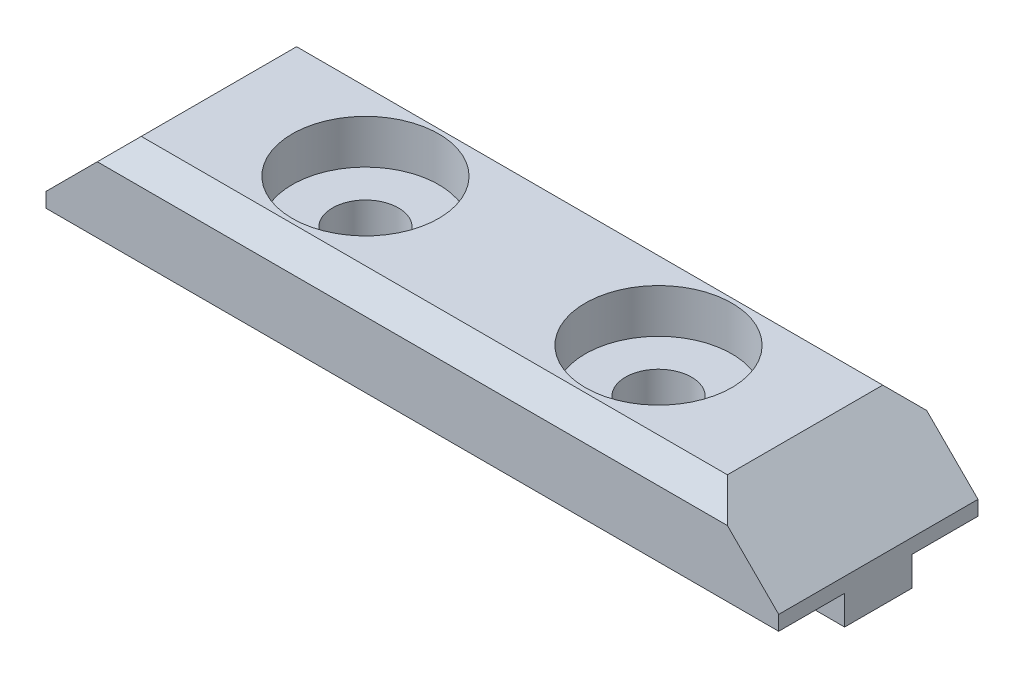
ISO-10303-21;
HEADER;
FILE_DESCRIPTION(('STEP AP214'),'2;1');
FILE_NAME('part.step','',(''),(''),'','','');
FILE_SCHEMA(('AUTOMOTIVE_DESIGN { 1 0 10303 214 1 1 1 1 }'));
ENDSEC;
DATA;
#1=APPLICATION_CONTEXT('core data for automotive mechanical design processes');
#2=APPLICATION_PROTOCOL_DEFINITION('international standard','automotive_design',2000,#1);
#3=PRODUCT_CONTEXT('',#1,'mechanical');
#4=PRODUCT('Part','Part','',(#3));
#5=PRODUCT_RELATED_PRODUCT_CATEGORY('part','',(#4));
#6=PRODUCT_DEFINITION_FORMATION('','',#4);
#7=PRODUCT_DEFINITION_CONTEXT('part definition',#1,'design');
#8=PRODUCT_DEFINITION('design','',#6,#7);
#9=PRODUCT_DEFINITION_SHAPE('','',#8);
#10=(LENGTH_UNIT() NAMED_UNIT(*) SI_UNIT(.MILLI.,.METRE.));
#11=(NAMED_UNIT(*) PLANE_ANGLE_UNIT() SI_UNIT($,.RADIAN.));
#12=(NAMED_UNIT(*) SI_UNIT($,.STERADIAN.) SOLID_ANGLE_UNIT());
#13=UNCERTAINTY_MEASURE_WITH_UNIT(LENGTH_MEASURE(1.E-05),#10,'distance_accuracy_value','');
#14=(GEOMETRIC_REPRESENTATION_CONTEXT(3) GLOBAL_UNCERTAINTY_ASSIGNED_CONTEXT((#13)) GLOBAL_UNIT_ASSIGNED_CONTEXT((#10,
#11,#12)) REPRESENTATION_CONTEXT('',''));
#15=CARTESIAN_POINT('',(0.,0.,0.));
#16=DIRECTION('',(0.,0.,1.));
#17=DIRECTION('',(1.,0.,0.));
#18=AXIS2_PLACEMENT_3D('',#15,#16,#17);
#19=CARTESIAN_POINT('',(50.,2.,2.3));
#20=DIRECTION('',(0.,0.,-1.));
#21=DIRECTION('',(0.,1.,0.));
#22=AXIS2_PLACEMENT_3D('',#19,#20,#21);
#23=PLANE('',#22);
#24=DIRECTION('',(0.,-1.,0.));
#25=VECTOR('',#24,1.);
#26=CARTESIAN_POINT('',(0.,2.,2.3));
#27=LINE('',#26,#25);
#28=CARTESIAN_POINT('',(0.,2.,2.3));
#29=VERTEX_POINT('',#28);
#30=CARTESIAN_POINT('',(0.,0.,2.3));
#31=VERTEX_POINT('',#30);
#32=EDGE_CURVE('E156',#29,#31,#27,.T.);
#33=ORIENTED_EDGE('',*,*,#32,.T.);
#34=DIRECTION('',(-1.,0.,0.));
#35=VECTOR('',#34,1.);
#36=CARTESIAN_POINT('',(50.,0.,2.3));
#37=LINE('',#36,#35);
#38=CARTESIAN_POINT('',(50.,0.,2.3));
#39=VERTEX_POINT('',#38);
#40=EDGE_CURVE('E136',#39,#31,#37,.T.);
#41=ORIENTED_EDGE('',*,*,#40,.F.);
#42=DIRECTION('',(0.,-1.,0.));
#43=VECTOR('',#42,1.);
#44=CARTESIAN_POINT('',(50.,2.,2.3));
#45=LINE('',#44,#43);
#46=CARTESIAN_POINT('',(50.,2.,2.3));
#47=VERTEX_POINT('',#46);
#48=EDGE_CURVE('E143',#47,#39,#45,.T.);
#49=ORIENTED_EDGE('',*,*,#48,.F.);
#50=DIRECTION('',(-1.,0.,0.));
#51=VECTOR('',#50,1.);
#52=CARTESIAN_POINT('',(50.,2.,2.3));
#53=LINE('',#52,#51);
#54=EDGE_CURVE('E218',#47,#29,#53,.T.);
#55=ORIENTED_EDGE('',*,*,#54,.T.);
#56=EDGE_LOOP('',(#33,#41,#49,#55));
#57=FACE_BOUND('',#56,.T.);
#58=ADVANCED_FACE('F38',(#57),#23,.F.);
#59=CARTESIAN_POINT('',(50.,0.,2.3));
#60=DIRECTION('',(0.,1.,0.));
#61=DIRECTION('',(0.,0.,1.));
#62=AXIS2_PLACEMENT_3D('',#59,#60,#61);
#63=PLANE('',#62);
#64=CARTESIAN_POINT('',(15.,0.,0.));
#65=DIRECTION('',(0.,1.,0.));
#66=DIRECTION('',(0.,0.,1.));
#67=AXIS2_PLACEMENT_3D('',#64,#65,#66);
#68=CIRCLE('',#67,2.24999999999999);
#69=CARTESIAN_POINT('',(15.,0.,2.24999999999999));
#70=VERTEX_POINT('',#69);
#71=EDGE_CURVE('E43',#70,#70,#68,.T.);
#72=ORIENTED_EDGE('',*,*,#71,.T.);
#73=EDGE_LOOP('',(#72));
#74=FACE_BOUND('',#73,.T.);
#75=CARTESIAN_POINT('',(35.,0.,0.));
#76=DIRECTION('',(0.,1.,0.));
#77=DIRECTION('',(0.,0.,1.));
#78=AXIS2_PLACEMENT_3D('',#75,#76,#77);
#79=CIRCLE('',#78,2.24999999999998);
#80=CARTESIAN_POINT('',(35.,0.,2.24999999999998));
#81=VERTEX_POINT('',#80);
#82=EDGE_CURVE('E194',#81,#81,#79,.T.);
#83=ORIENTED_EDGE('',*,*,#82,.T.);
#84=EDGE_LOOP('',(#83));
#85=FACE_BOUND('',#84,.T.);
#86=DIRECTION('',(0.,0.,-1.));
#87=VECTOR('',#86,1.);
#88=CARTESIAN_POINT('',(0.,0.,2.3));
#89=LINE('',#88,#87);
#90=CARTESIAN_POINT('',(0.,0.,-2.3));
#91=VERTEX_POINT('',#90);
#92=EDGE_CURVE('E199',#31,#91,#89,.T.);
#93=ORIENTED_EDGE('',*,*,#92,.T.);
#94=DIRECTION('',(-1.,0.,0.));
#95=VECTOR('',#94,1.);
#96=CARTESIAN_POINT('',(50.,0.,-2.3));
#97=LINE('',#96,#95);
#98=CARTESIAN_POINT('',(50.,0.,-2.3));
#99=VERTEX_POINT('',#98);
#100=EDGE_CURVE('E139',#99,#91,#97,.T.);
#101=ORIENTED_EDGE('',*,*,#100,.F.);
#102=DIRECTION('',(0.,0.,-1.));
#103=VECTOR('',#102,1.);
#104=CARTESIAN_POINT('',(50.,0.,2.3));
#105=LINE('',#104,#103);
#106=EDGE_CURVE('E132',#39,#99,#105,.T.);
#107=ORIENTED_EDGE('',*,*,#106,.F.);
#108=ORIENTED_EDGE('',*,*,#40,.T.);
#109=EDGE_LOOP('',(#93,#101,#107,#108));
#110=FACE_BOUND('',#109,.T.);
#111=ADVANCED_FACE('F134',(#74,#85,#110),#63,.F.);
#112=CARTESIAN_POINT('',(50.,0.,-2.3));
#113=DIRECTION('',(0.,0.,1.));
#114=DIRECTION('',(0.,-1.,0.));
#115=AXIS2_PLACEMENT_3D('',#112,#113,#114);
#116=PLANE('',#115);
#117=DIRECTION('',(0.,1.,0.));
#118=VECTOR('',#117,1.);
#119=CARTESIAN_POINT('',(0.,0.,-2.3));
#120=LINE('',#119,#118);
#121=CARTESIAN_POINT('',(0.,2.,-2.3));
#122=VERTEX_POINT('',#121);
#123=EDGE_CURVE('E221',#91,#122,#120,.T.);
#124=ORIENTED_EDGE('',*,*,#123,.T.);
#125=DIRECTION('',(-1.,0.,0.));
#126=VECTOR('',#125,1.);
#127=CARTESIAN_POINT('',(50.,2.,-2.3));
#128=LINE('',#127,#126);
#129=CARTESIAN_POINT('',(50.,2.,-2.3));
#130=VERTEX_POINT('',#129);
#131=EDGE_CURVE('E162',#130,#122,#128,.T.);
#132=ORIENTED_EDGE('',*,*,#131,.F.);
#133=DIRECTION('',(0.,1.,0.));
#134=VECTOR('',#133,1.);
#135=CARTESIAN_POINT('',(50.,0.,-2.3));
#136=LINE('',#135,#134);
#137=EDGE_CURVE('E142',#99,#130,#136,.T.);
#138=ORIENTED_EDGE('',*,*,#137,.F.);
#139=ORIENTED_EDGE('',*,*,#100,.T.);
#140=EDGE_LOOP('',(#124,#132,#138,#139));
#141=FACE_BOUND('',#140,.T.);
#142=ADVANCED_FACE('F265',(#141),#116,.F.);
#143=CARTESIAN_POINT('',(50.,2.,-2.3));
#144=DIRECTION('',(0.,1.,0.));
#145=DIRECTION('',(0.,0.,1.));
#146=AXIS2_PLACEMENT_3D('',#143,#144,#145);
#147=PLANE('',#146);
#148=DIRECTION('',(0.,0.,-1.));
#149=VECTOR('',#148,1.);
#150=CARTESIAN_POINT('',(0.,2.,-2.3));
#151=LINE('',#150,#149);
#152=CARTESIAN_POINT('',(0.,2.,-6.8));
#153=VERTEX_POINT('',#152);
#154=EDGE_CURVE('E223',#122,#153,#151,.T.);
#155=ORIENTED_EDGE('',*,*,#154,.T.);
#156=DIRECTION('',(-1.,0.,0.));
#157=VECTOR('',#156,1.);
#158=CARTESIAN_POINT('',(50.,2.,-6.8));
#159=LINE('',#158,#157);
#160=CARTESIAN_POINT('',(50.,2.,-6.8));
#161=VERTEX_POINT('',#160);
#162=EDGE_CURVE('E234',#161,#153,#159,.T.);
#163=ORIENTED_EDGE('',*,*,#162,.F.);
#164=DIRECTION('',(0.,0.,-1.));
#165=VECTOR('',#164,1.);
#166=CARTESIAN_POINT('',(50.,2.,-2.3));
#167=LINE('',#166,#165);
#168=EDGE_CURVE('E212',#130,#161,#167,.T.);
#169=ORIENTED_EDGE('',*,*,#168,.F.);
#170=ORIENTED_EDGE('',*,*,#131,.T.);
#171=EDGE_LOOP('',(#155,#163,#169,#170));
#172=FACE_BOUND('',#171,.T.);
#173=ADVANCED_FACE('F241',(#172),#147,.F.);
#174=CARTESIAN_POINT('',(50.,2.,-6.8));
#175=DIRECTION('',(0.,0.,1.));
#176=DIRECTION('',(0.,-1.,0.));
#177=AXIS2_PLACEMENT_3D('',#174,#175,#176);
#178=PLANE('',#177);
#179=DIRECTION('',(1.,0.,0.));
#180=VECTOR('',#179,1.);
#181=CARTESIAN_POINT('',(50.,6.49999999999999,-6.8));
#182=LINE('',#181,#180);
#183=CARTESIAN_POINT('',(3.5,6.49999999999999,-6.8));
#184=VERTEX_POINT('',#183);
#185=CARTESIAN_POINT('',(46.5,6.49999999999999,-6.8));
#186=VERTEX_POINT('',#185);
#187=EDGE_CURVE('E168',#184,#186,#182,.T.);
#188=ORIENTED_EDGE('',*,*,#187,.T.);
#189=DIRECTION('',(0.707106781186549,-0.707106781186546,0.));
#190=VECTOR('',#189,1.);
#191=CARTESIAN_POINT('',(50.,3.00000000000001,-6.8));
#192=LINE('',#191,#190);
#193=CARTESIAN_POINT('',(50.,3.00000000000001,-6.8));
#194=VERTEX_POINT('',#193);
#195=EDGE_CURVE('E48',#186,#194,#192,.T.);
#196=ORIENTED_EDGE('',*,*,#195,.T.);
#197=DIRECTION('',(0.,1.,0.));
#198=VECTOR('',#197,1.);
#199=CARTESIAN_POINT('',(50.,2.,-6.8));
#200=LINE('',#199,#198);
#201=EDGE_CURVE('E214',#161,#194,#200,.T.);
#202=ORIENTED_EDGE('',*,*,#201,.F.);
#203=ORIENTED_EDGE('',*,*,#162,.T.);
#204=DIRECTION('',(0.,1.,0.));
#205=VECTOR('',#204,1.);
#206=CARTESIAN_POINT('',(0.,2.,-6.8));
#207=LINE('',#206,#205);
#208=CARTESIAN_POINT('',(0.,2.99999999999999,-6.8));
#209=VERTEX_POINT('',#208);
#210=EDGE_CURVE('E225',#153,#209,#207,.T.);
#211=ORIENTED_EDGE('',*,*,#210,.T.);
#212=DIRECTION('',(-0.707106781186547,-0.707106781186549,0.));
#213=VECTOR('',#212,1.);
#214=CARTESIAN_POINT('',(5.,8.,-6.8));
#215=LINE('',#214,#213);
#216=EDGE_CURVE('E192',#209,#184,#215,.F.);
#217=ORIENTED_EDGE('',*,*,#216,.T.);
#218=EDGE_LOOP('',(#188,#196,#202,#203,#211,#217));
#219=FACE_BOUND('',#218,.T.);
#220=ADVANCED_FACE('F248',(#219),#178,.F.);
#221=CARTESIAN_POINT('',(50.,8.,-6.8));
#222=DIRECTION('',(0.,-1.,0.));
#223=DIRECTION('',(0.,0.,-1.));
#224=AXIS2_PLACEMENT_3D('',#221,#222,#223);
#225=PLANE('',#224);
#226=CARTESIAN_POINT('',(15.,8.,0.));
#227=DIRECTION('',(0.,1.,0.));
#228=DIRECTION('',(0.,0.,1.));
#229=AXIS2_PLACEMENT_3D('',#226,#227,#228);
#230=CIRCLE('',#229,5.);
#231=CARTESIAN_POINT('',(15.,8.,5.));
#232=VERTEX_POINT('',#231);
#233=EDGE_CURVE('E497',#232,#232,#230,.T.);
#234=ORIENTED_EDGE('',*,*,#233,.F.);
#235=EDGE_LOOP('',(#234));
#236=FACE_BOUND('',#235,.T.);
#237=CARTESIAN_POINT('',(35.,8.,0.));
#238=DIRECTION('',(0.,1.,0.));
#239=DIRECTION('',(0.,0.,1.));
#240=AXIS2_PLACEMENT_3D('',#237,#238,#239);
#241=CIRCLE('',#240,5.);
#242=CARTESIAN_POINT('',(35.,8.,5.));
#243=VERTEX_POINT('',#242);
#244=EDGE_CURVE('E207',#243,#243,#241,.T.);
#245=ORIENTED_EDGE('',*,*,#244,.F.);
#246=EDGE_LOOP('',(#245));
#247=FACE_BOUND('',#246,.T.);
#248=DIRECTION('',(1.,0.,0.));
#249=VECTOR('',#248,1.);
#250=CARTESIAN_POINT('',(50.,8.,5.30000000000001));
#251=LINE('',#250,#249);
#252=CARTESIAN_POINT('',(5.,8.,5.30000000000001));
#253=VERTEX_POINT('',#252);
#254=CARTESIAN_POINT('',(45.,8.,5.30000000000001));
#255=VERTEX_POINT('',#254);
#256=EDGE_CURVE('E157',#253,#255,#251,.T.);
#257=ORIENTED_EDGE('',*,*,#256,.T.);
#258=DIRECTION('',(0.,0.,-1.));
#259=VECTOR('',#258,1.);
#260=CARTESIAN_POINT('',(45.,8.,-5.29999999999999));
#261=LINE('',#260,#259);
#262=CARTESIAN_POINT('',(45.,8.,-5.29999999999999));
#263=VERTEX_POINT('',#262);
#264=EDGE_CURVE('E187',#255,#263,#261,.T.);
#265=ORIENTED_EDGE('',*,*,#264,.T.);
#266=DIRECTION('',(-1.,0.,0.));
#267=VECTOR('',#266,1.);
#268=CARTESIAN_POINT('',(50.,8.,-5.29999999999999));
#269=LINE('',#268,#267);
#270=CARTESIAN_POINT('',(5.,8.,-5.29999999999999));
#271=VERTEX_POINT('',#270);
#272=EDGE_CURVE('E160',#263,#271,#269,.T.);
#273=ORIENTED_EDGE('',*,*,#272,.T.);
#274=DIRECTION('',(0.,0.,1.));
#275=VECTOR('',#274,1.);
#276=CARTESIAN_POINT('',(5.,8.,-6.8));
#277=LINE('',#276,#275);
#278=EDGE_CURVE('E184',#271,#253,#277,.T.);
#279=ORIENTED_EDGE('',*,*,#278,.T.);
#280=EDGE_LOOP('',(#257,#265,#273,#279));
#281=FACE_BOUND('',#280,.T.);
#282=ADVANCED_FACE('F256',(#236,#247,#281),#225,.F.);
#283=CARTESIAN_POINT('',(50.,8.,6.8));
#284=DIRECTION('',(0.,0.,-1.));
#285=DIRECTION('',(0.,1.,0.));
#286=AXIS2_PLACEMENT_3D('',#283,#284,#285);
#287=PLANE('',#286);
#288=DIRECTION('',(0.,-1.,0.));
#289=VECTOR('',#288,1.);
#290=CARTESIAN_POINT('',(50.,8.,6.8));
#291=LINE('',#290,#289);
#292=CARTESIAN_POINT('',(50.,3.00000000000001,6.8));
#293=VERTEX_POINT('',#292);
#294=CARTESIAN_POINT('',(50.,2.,6.8));
#295=VERTEX_POINT('',#294);
#296=EDGE_CURVE('E216',#293,#295,#291,.T.);
#297=ORIENTED_EDGE('',*,*,#296,.F.);
#298=DIRECTION('',(-0.707106781186549,0.707106781186546,0.));
#299=VECTOR('',#298,1.);
#300=CARTESIAN_POINT('',(50.,3.00000000000001,6.8));
#301=LINE('',#300,#299);
#302=CARTESIAN_POINT('',(46.5,6.50000000000002,6.8));
#303=VERTEX_POINT('',#302);
#304=EDGE_CURVE('E178',#293,#303,#301,.T.);
#305=ORIENTED_EDGE('',*,*,#304,.T.);
#306=DIRECTION('',(-1.,0.,0.));
#307=VECTOR('',#306,1.);
#308=CARTESIAN_POINT('',(50.,6.50000000000002,6.8));
#309=LINE('',#308,#307);
#310=CARTESIAN_POINT('',(3.50000000000001,6.50000000000002,6.8));
#311=VERTEX_POINT('',#310);
#312=EDGE_CURVE('E170',#303,#311,#309,.T.);
#313=ORIENTED_EDGE('',*,*,#312,.T.);
#314=DIRECTION('',(0.707106781186547,0.707106781186549,0.));
#315=VECTOR('',#314,1.);
#316=CARTESIAN_POINT('',(5.,8.,6.8));
#317=LINE('',#316,#315);
#318=CARTESIAN_POINT('',(0.,2.99999999999999,6.8));
#319=VERTEX_POINT('',#318);
#320=EDGE_CURVE('E176',#311,#319,#317,.F.);
#321=ORIENTED_EDGE('',*,*,#320,.T.);
#322=DIRECTION('',(0.,-1.,0.));
#323=VECTOR('',#322,1.);
#324=CARTESIAN_POINT('',(0.,8.,6.8));
#325=LINE('',#324,#323);
#326=CARTESIAN_POINT('',(0.,2.,6.8));
#327=VERTEX_POINT('',#326);
#328=EDGE_CURVE('E227',#319,#327,#325,.T.);
#329=ORIENTED_EDGE('',*,*,#328,.T.);
#330=DIRECTION('',(-1.,0.,0.));
#331=VECTOR('',#330,1.);
#332=CARTESIAN_POINT('',(50.,2.,6.8));
#333=LINE('',#332,#331);
#334=EDGE_CURVE('E231',#295,#327,#333,.T.);
#335=ORIENTED_EDGE('',*,*,#334,.F.);
#336=EDGE_LOOP('',(#297,#305,#313,#321,#329,#335));
#337=FACE_BOUND('',#336,.T.);
#338=ADVANCED_FACE('F320',(#337),#287,.F.);
#339=CARTESIAN_POINT('',(50.,2.,6.8));
#340=DIRECTION('',(0.,1.,0.));
#341=DIRECTION('',(0.,0.,1.));
#342=AXIS2_PLACEMENT_3D('',#339,#340,#341);
#343=PLANE('',#342);
#344=DIRECTION('',(0.,0.,-1.));
#345=VECTOR('',#344,1.);
#346=CARTESIAN_POINT('',(0.,2.,6.8));
#347=LINE('',#346,#345);
#348=EDGE_CURVE('E153',#327,#29,#347,.T.);
#349=ORIENTED_EDGE('',*,*,#348,.T.);
#350=ORIENTED_EDGE('',*,*,#54,.F.);
#351=DIRECTION('',(0.,0.,-1.));
#352=VECTOR('',#351,1.);
#353=CARTESIAN_POINT('',(50.,2.,6.8));
#354=LINE('',#353,#352);
#355=EDGE_CURVE('E149',#295,#47,#354,.T.);
#356=ORIENTED_EDGE('',*,*,#355,.F.);
#357=ORIENTED_EDGE('',*,*,#334,.T.);
#358=EDGE_LOOP('',(#349,#350,#356,#357));
#359=FACE_BOUND('',#358,.T.);
#360=ADVANCED_FACE('F315',(#359),#343,.F.);
#361=CARTESIAN_POINT('',(50.,0.,0.));
#362=DIRECTION('',(1.,0.,0.));
#363=DIRECTION('',(0.,0.,-1.));
#364=AXIS2_PLACEMENT_3D('',#361,#362,#363);
#365=PLANE('',#364);
#366=ORIENTED_EDGE('',*,*,#201,.T.);
#367=DIRECTION('',(0.,0.,1.));
#368=VECTOR('',#367,1.);
#369=CARTESIAN_POINT('',(50.,3.00000000000001,5.30000000000001));
#370=LINE('',#369,#368);
#371=EDGE_CURVE('E173',#194,#293,#370,.T.);
#372=ORIENTED_EDGE('',*,*,#371,.T.);
#373=ORIENTED_EDGE('',*,*,#296,.T.);
#374=ORIENTED_EDGE('',*,*,#355,.T.);
#375=ORIENTED_EDGE('',*,*,#48,.T.);
#376=ORIENTED_EDGE('',*,*,#106,.T.);
#377=ORIENTED_EDGE('',*,*,#137,.T.);
#378=ORIENTED_EDGE('',*,*,#168,.T.);
#379=EDGE_LOOP('',(#366,#372,#373,#374,#375,#376,#377,#378));
#380=FACE_BOUND('',#379,.T.);
#381=ADVANCED_FACE('F147',(#380),#365,.T.);
#382=CARTESIAN_POINT('',(0.,0.,0.));
#383=DIRECTION('',(1.,0.,0.));
#384=DIRECTION('',(0.,0.,-1.));
#385=AXIS2_PLACEMENT_3D('',#382,#383,#384);
#386=PLANE('',#385);
#387=ORIENTED_EDGE('',*,*,#328,.F.);
#388=DIRECTION('',(0.,0.,-1.));
#389=VECTOR('',#388,1.);
#390=CARTESIAN_POINT('',(0.,2.99999999999999,0.));
#391=LINE('',#390,#389);
#392=EDGE_CURVE('E11',#319,#209,#391,.T.);
#393=ORIENTED_EDGE('',*,*,#392,.T.);
#394=ORIENTED_EDGE('',*,*,#210,.F.);
#395=ORIENTED_EDGE('',*,*,#154,.F.);
#396=ORIENTED_EDGE('',*,*,#123,.F.);
#397=ORIENTED_EDGE('',*,*,#92,.F.);
#398=ORIENTED_EDGE('',*,*,#32,.F.);
#399=ORIENTED_EDGE('',*,*,#348,.F.);
#400=EDGE_LOOP('',(#387,#393,#394,#395,#396,#397,#398,#399));
#401=FACE_BOUND('',#400,.T.);
#402=ADVANCED_FACE('F245',(#401),#386,.F.);
#403=CARTESIAN_POINT('',(50.,8.,-5.29999999999999));
#404=DIRECTION('',(0.,-0.707106781186548,0.707106781186548));
#405=DIRECTION('',(-1.,0.,0.));
#406=AXIS2_PLACEMENT_3D('',#403,#404,#405);
#407=PLANE('',#406);
#408=ORIENTED_EDGE('',*,*,#272,.F.);
#409=DIRECTION('',(-0.577350269189628,0.577350269189625,0.577350269189625));
#410=VECTOR('',#409,1.);
#411=CARTESIAN_POINT('',(46.6666666666667,6.33333333333333,-6.96666666666666));
#412=LINE('',#411,#410);
#413=EDGE_CURVE('E62',#263,#186,#412,.F.);
#414=ORIENTED_EDGE('',*,*,#413,.T.);
#415=ORIENTED_EDGE('',*,*,#187,.F.);
#416=DIRECTION('',(0.577350269189625,0.577350269189626,0.577350269189626));
#417=VECTOR('',#416,1.);
#418=CARTESIAN_POINT('',(19.9999999999999,23.,9.7));
#419=LINE('',#418,#417);
#420=EDGE_CURVE('E189',#184,#271,#419,.T.);
#421=ORIENTED_EDGE('',*,*,#420,.T.);
#422=EDGE_LOOP('',(#408,#414,#415,#421));
#423=FACE_BOUND('',#422,.T.);
#424=ADVANCED_FACE('F254',(#423),#407,.F.);
#425=CARTESIAN_POINT('',(50.,6.50000000000002,6.8));
#426=DIRECTION('',(0.,-0.707106781186549,-0.707106781186546));
#427=DIRECTION('',(-1.,0.,0.));
#428=AXIS2_PLACEMENT_3D('',#425,#426,#427);
#429=PLANE('',#428);
#430=ORIENTED_EDGE('',*,*,#312,.F.);
#431=DIRECTION('',(0.577350269189627,-0.577350269189624,0.577350269189627));
#432=VECTOR('',#431,1.);
#433=CARTESIAN_POINT('',(47.6666666666667,5.33333333333335,7.96666666666668));
#434=LINE('',#433,#432);
#435=EDGE_CURVE('E182',#303,#255,#434,.F.);
#436=ORIENTED_EDGE('',*,*,#435,.T.);
#437=ORIENTED_EDGE('',*,*,#256,.F.);
#438=DIRECTION('',(-0.577350269189624,-0.577350269189626,0.577350269189628));
#439=VECTOR('',#438,1.);
#440=CARTESIAN_POINT('',(18.9999999999999,22.,-8.7));
#441=LINE('',#440,#439);
#442=EDGE_CURVE('E180',#253,#311,#441,.T.);
#443=ORIENTED_EDGE('',*,*,#442,.T.);
#444=EDGE_LOOP('',(#430,#436,#437,#443));
#445=FACE_BOUND('',#444,.T.);
#446=ADVANCED_FACE('F286',(#445),#429,.F.);
#447=CARTESIAN_POINT('',(50.,3.00000000000001,0.));
#448=DIRECTION('',(0.707106781186546,0.707106781186549,0.));
#449=DIRECTION('',(0.,0.,-1.));
#450=AXIS2_PLACEMENT_3D('',#447,#448,#449);
#451=PLANE('',#450);
#452=ORIENTED_EDGE('',*,*,#413,.F.);
#453=ORIENTED_EDGE('',*,*,#264,.F.);
#454=ORIENTED_EDGE('',*,*,#435,.F.);
#455=ORIENTED_EDGE('',*,*,#304,.F.);
#456=ORIENTED_EDGE('',*,*,#371,.F.);
#457=ORIENTED_EDGE('',*,*,#195,.F.);
#458=EDGE_LOOP('',(#452,#453,#454,#455,#456,#457));
#459=FACE_BOUND('',#458,.T.);
#460=ADVANCED_FACE('F261',(#459),#451,.T.);
#461=CARTESIAN_POINT('',(5.,8.,-6.8));
#462=DIRECTION('',(0.707106781186548,-0.707106781186546,0.));
#463=DIRECTION('',(0.,0.,1.));
#464=AXIS2_PLACEMENT_3D('',#461,#462,#463);
#465=PLANE('',#464);
#466=ORIENTED_EDGE('',*,*,#216,.F.);
#467=ORIENTED_EDGE('',*,*,#392,.F.);
#468=ORIENTED_EDGE('',*,*,#320,.F.);
#469=ORIENTED_EDGE('',*,*,#442,.F.);
#470=ORIENTED_EDGE('',*,*,#278,.F.);
#471=ORIENTED_EDGE('',*,*,#420,.F.);
#472=EDGE_LOOP('',(#466,#467,#468,#469,#470,#471));
#473=FACE_BOUND('',#472,.T.);
#474=ADVANCED_FACE('F41',(#473),#465,.F.);
#475=CARTESIAN_POINT('',(35.,8.,0.));
#476=DIRECTION('',(0.,1.,0.));
#477=DIRECTION('',(0.,0.,1.));
#478=AXIS2_PLACEMENT_3D('',#475,#476,#477);
#479=CYLINDRICAL_SURFACE('',#478,2.24999999999998);
#480=CARTESIAN_POINT('',(35.,5.,0.));
#481=DIRECTION('',(0.,1.,0.));
#482=DIRECTION('',(0.,0.,1.));
#483=AXIS2_PLACEMENT_3D('',#480,#481,#482);
#484=CIRCLE('',#483,2.24999999999999);
#485=CARTESIAN_POINT('',(35.,5.,2.24999999999999));
#486=VERTEX_POINT('',#485);
#487=EDGE_CURVE('E196',#486,#486,#484,.T.);
#488=ORIENTED_EDGE('',*,*,#487,.T.);
#489=EDGE_LOOP('',(#488));
#490=FACE_BOUND('',#489,.T.);
#491=ORIENTED_EDGE('',*,*,#82,.F.);
#492=EDGE_LOOP('',(#491));
#493=FACE_BOUND('',#492,.T.);
#494=ADVANCED_FACE('F298',(#490,#493),#479,.F.);
#495=CARTESIAN_POINT('',(37.25,5.,0.));
#496=DIRECTION('',(0.,-1.,0.));
#497=DIRECTION('',(0.,0.,-1.));
#498=AXIS2_PLACEMENT_3D('',#495,#496,#497);
#499=PLANE('',#498);
#500=ORIENTED_EDGE('',*,*,#487,.F.);
#501=EDGE_LOOP('',(#500));
#502=FACE_BOUND('',#501,.T.);
#503=CARTESIAN_POINT('',(35.,5.,0.));
#504=DIRECTION('',(0.,1.,0.));
#505=DIRECTION('',(0.,0.,1.));
#506=AXIS2_PLACEMENT_3D('',#503,#504,#505);
#507=CIRCLE('',#506,5.);
#508=CARTESIAN_POINT('',(35.,5.,5.));
#509=VERTEX_POINT('',#508);
#510=EDGE_CURVE('E202',#509,#509,#507,.T.);
#511=ORIENTED_EDGE('',*,*,#510,.T.);
#512=EDGE_LOOP('',(#511));
#513=FACE_BOUND('',#512,.T.);
#514=ADVANCED_FACE('F302',(#502,#513),#499,.F.);
#515=CARTESIAN_POINT('',(35.,8.,0.));
#516=DIRECTION('',(0.,1.,0.));
#517=DIRECTION('',(0.,0.,1.));
#518=AXIS2_PLACEMENT_3D('',#515,#516,#517);
#519=CYLINDRICAL_SURFACE('',#518,5.);
#520=ORIENTED_EDGE('',*,*,#510,.F.);
#521=EDGE_LOOP('',(#520));
#522=FACE_BOUND('',#521,.T.);
#523=ORIENTED_EDGE('',*,*,#244,.T.);
#524=EDGE_LOOP('',(#523));
#525=FACE_BOUND('',#524,.T.);
#526=ADVANCED_FACE('F307',(#522,#525),#519,.F.);
#527=CARTESIAN_POINT('',(15.,8.,0.));
#528=DIRECTION('',(0.,1.,0.));
#529=DIRECTION('',(0.,0.,1.));
#530=AXIS2_PLACEMENT_3D('',#527,#528,#529);
#531=CYLINDRICAL_SURFACE('',#530,2.24999999999999);
#532=CARTESIAN_POINT('',(15.,5.,0.));
#533=DIRECTION('',(0.,1.,0.));
#534=DIRECTION('',(0.,0.,1.));
#535=AXIS2_PLACEMENT_3D('',#532,#533,#534);
#536=CIRCLE('',#535,2.24999999999999);
#537=CARTESIAN_POINT('',(15.,5.,2.24999999999999));
#538=VERTEX_POINT('',#537);
#539=EDGE_CURVE('E499',#538,#538,#536,.T.);
#540=ORIENTED_EDGE('',*,*,#539,.T.);
#541=EDGE_LOOP('',(#540));
#542=FACE_BOUND('',#541,.T.);
#543=ORIENTED_EDGE('',*,*,#71,.F.);
#544=EDGE_LOOP('',(#543));
#545=FACE_BOUND('',#544,.T.);
#546=ADVANCED_FACE('F447',(#542,#545),#531,.F.);
#547=CARTESIAN_POINT('',(17.25,5.,0.));
#548=DIRECTION('',(0.,-1.,0.));
#549=DIRECTION('',(0.,0.,-1.));
#550=AXIS2_PLACEMENT_3D('',#547,#548,#549);
#551=PLANE('',#550);
#552=ORIENTED_EDGE('',*,*,#539,.F.);
#553=EDGE_LOOP('',(#552));
#554=FACE_BOUND('',#553,.T.);
#555=CARTESIAN_POINT('',(15.,5.,0.));
#556=DIRECTION('',(0.,1.,0.));
#557=DIRECTION('',(0.,0.,1.));
#558=AXIS2_PLACEMENT_3D('',#555,#556,#557);
#559=CIRCLE('',#558,5.);
#560=CARTESIAN_POINT('',(15.,5.,5.));
#561=VERTEX_POINT('',#560);
#562=EDGE_CURVE('E494',#561,#561,#559,.T.);
#563=ORIENTED_EDGE('',*,*,#562,.T.);
#564=EDGE_LOOP('',(#563));
#565=FACE_BOUND('',#564,.T.);
#566=ADVANCED_FACE('F456',(#554,#565),#551,.F.);
#567=CARTESIAN_POINT('',(15.,8.,0.));
#568=DIRECTION('',(0.,1.,0.));
#569=DIRECTION('',(0.,0.,1.));
#570=AXIS2_PLACEMENT_3D('',#567,#568,#569);
#571=CYLINDRICAL_SURFACE('',#570,5.);
#572=ORIENTED_EDGE('',*,*,#562,.F.);
#573=EDGE_LOOP('',(#572));
#574=FACE_BOUND('',#573,.T.);
#575=ORIENTED_EDGE('',*,*,#233,.T.);
#576=EDGE_LOOP('',(#575));
#577=FACE_BOUND('',#576,.T.);
#578=ADVANCED_FACE('F466',(#574,#577),#571,.F.);
#579=CLOSED_SHELL('',(#58,#111,#142,#173,#220,#282,#338,#360,#381,#402,#424,#446,#460,#474,#494,
#514,#526,#546,#566,#578));
#580=MANIFOLD_SOLID_BREP('B2',#579);
#581=ADVANCED_BREP_SHAPE_REPRESENTATION('',(#18,#580),#14);
#582=SHAPE_DEFINITION_REPRESENTATION(#9,#581);
ENDSEC;
END-ISO-10303-21;
